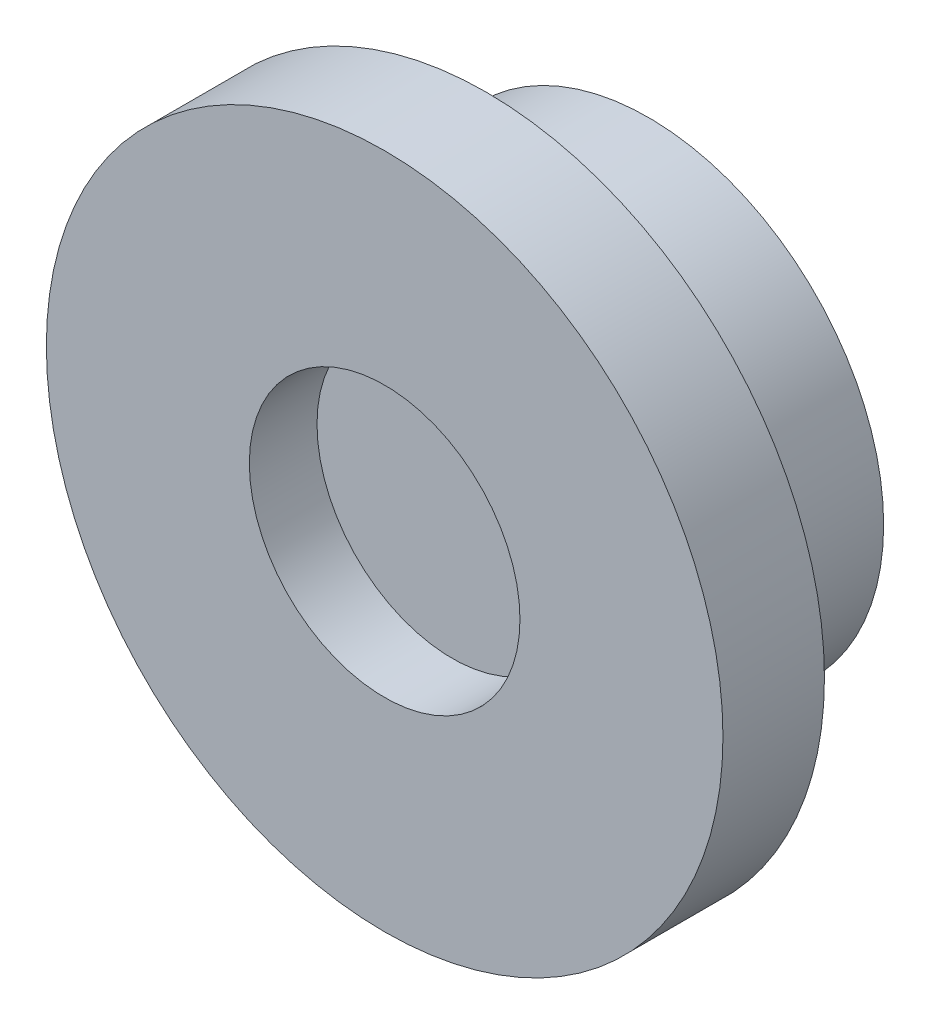
ISO-10303-21;
HEADER;
FILE_DESCRIPTION(('STEP AP214'),'2;1');
FILE_NAME('part.step','',(''),(''),'','','');
FILE_SCHEMA(('AUTOMOTIVE_DESIGN { 1 0 10303 214 1 1 1 1 }'));
ENDSEC;
DATA;
#1=APPLICATION_CONTEXT('core data for automotive mechanical design processes');
#2=APPLICATION_PROTOCOL_DEFINITION('international standard','automotive_design',2000,#1);
#3=PRODUCT_CONTEXT('',#1,'mechanical');
#4=PRODUCT('Part','Part','',(#3));
#5=PRODUCT_RELATED_PRODUCT_CATEGORY('part','',(#4));
#6=PRODUCT_DEFINITION_FORMATION('','',#4);
#7=PRODUCT_DEFINITION_CONTEXT('part definition',#1,'design');
#8=PRODUCT_DEFINITION('design','',#6,#7);
#9=PRODUCT_DEFINITION_SHAPE('','',#8);
#10=(LENGTH_UNIT() NAMED_UNIT(*) SI_UNIT(.MILLI.,.METRE.));
#11=(NAMED_UNIT(*) PLANE_ANGLE_UNIT() SI_UNIT($,.RADIAN.));
#12=(NAMED_UNIT(*) SI_UNIT($,.STERADIAN.) SOLID_ANGLE_UNIT());
#13=UNCERTAINTY_MEASURE_WITH_UNIT(LENGTH_MEASURE(1.E-05),#10,'distance_accuracy_value','');
#14=(GEOMETRIC_REPRESENTATION_CONTEXT(3) GLOBAL_UNCERTAINTY_ASSIGNED_CONTEXT((#13)) GLOBAL_UNIT_ASSIGNED_CONTEXT((#10,
#11,#12)) REPRESENTATION_CONTEXT('',''));
#15=CARTESIAN_POINT('',(0.,0.,0.));
#16=DIRECTION('',(0.,0.,1.));
#17=DIRECTION('',(1.,0.,0.));
#18=AXIS2_PLACEMENT_3D('',#15,#16,#17);
#19=CARTESIAN_POINT('',(0.,0.,51.7));
#20=DIRECTION('',(0.,0.,1.));
#21=DIRECTION('',(1.,0.,0.));
#22=AXIS2_PLACEMENT_3D('',#19,#20,#21);
#23=PLANE('',#22);
#24=CARTESIAN_POINT('',(0.,0.,51.7));
#25=DIRECTION('',(0.,0.,1.));
#26=DIRECTION('',(1.,0.,0.));
#27=AXIS2_PLACEMENT_3D('',#24,#25,#26);
#28=CIRCLE('',#27,6.95);
#29=CARTESIAN_POINT('',(6.95,0.,51.7));
#30=VERTEX_POINT('',#29);
#31=EDGE_CURVE('E9',#30,#30,#28,.T.);
#32=ORIENTED_EDGE('',*,*,#31,.F.);
#33=EDGE_LOOP('',(#32));
#34=FACE_BOUND('',#33,.T.);
#35=ADVANCED_FACE('F15',(#34),#23,.F.);
#36=CARTESIAN_POINT('',(0.,0.,57.5));
#37=DIRECTION('',(0.,0.,1.));
#38=DIRECTION('',(1.,0.,0.));
#39=AXIS2_PLACEMENT_3D('',#36,#37,#38);
#40=PLANE('',#39);
#41=CARTESIAN_POINT('',(0.,0.,57.5));
#42=DIRECTION('',(0.,0.,1.));
#43=DIRECTION('',(1.,0.,0.));
#44=AXIS2_PLACEMENT_3D('',#41,#42,#43);
#45=CIRCLE('',#44,4.);
#46=CARTESIAN_POINT('',(4.,0.,57.5));
#47=VERTEX_POINT('',#46);
#48=EDGE_CURVE('E37',#47,#47,#45,.T.);
#49=ORIENTED_EDGE('',*,*,#48,.T.);
#50=EDGE_LOOP('',(#49));
#51=FACE_BOUND('',#50,.T.);
#52=ADVANCED_FACE('F132',(#51),#40,.T.);
#53=CARTESIAN_POINT('',(0.,0.,51.7));
#54=DIRECTION('',(0.,0.,1.));
#55=DIRECTION('',(1.,0.,0.));
#56=AXIS2_PLACEMENT_3D('',#53,#54,#55);
#57=CYLINDRICAL_SURFACE('',#56,6.95);
#58=CARTESIAN_POINT('',(0.,0.,56.5));
#59=DIRECTION('',(0.,0.,1.));
#60=DIRECTION('',(1.,0.,0.));
#61=AXIS2_PLACEMENT_3D('',#58,#59,#60);
#62=CIRCLE('',#61,6.95);
#63=CARTESIAN_POINT('',(6.95,0.,56.5));
#64=VERTEX_POINT('',#63);
#65=EDGE_CURVE('E82',#64,#64,#62,.T.);
#66=ORIENTED_EDGE('',*,*,#65,.F.);
#67=DIRECTION('',(0.,0.,1.));
#68=VECTOR('',#67,1.);
#69=CARTESIAN_POINT('',(6.95,0.,51.7));
#70=LINE('',#69,#68);
#71=EDGE_CURVE('E23',#30,#64,#70,.T.);
#72=ORIENTED_EDGE('',*,*,#71,.F.);
#73=ORIENTED_EDGE('',*,*,#31,.T.);
#74=ORIENTED_EDGE('',*,*,#71,.T.);
#75=EDGE_LOOP('',(#66,#72,#73,#74));
#76=FACE_BOUND('',#75,.T.);
#77=ADVANCED_FACE('F122',(#76),#57,.T.);
#78=CARTESIAN_POINT('',(0.,0.,57.5));
#79=DIRECTION('',(0.,0.,1.));
#80=DIRECTION('',(1.,0.,0.));
#81=AXIS2_PLACEMENT_3D('',#78,#79,#80);
#82=CYLINDRICAL_SURFACE('',#81,4.);
#83=DIRECTION('',(0.,0.,1.));
#84=VECTOR('',#83,1.);
#85=CARTESIAN_POINT('',(4.,0.,57.5));
#86=LINE('',#85,#84);
#87=CARTESIAN_POINT('',(4.,0.,59.5));
#88=VERTEX_POINT('',#87);
#89=EDGE_CURVE('E85',#47,#88,#86,.T.);
#90=ORIENTED_EDGE('',*,*,#89,.F.);
#91=ORIENTED_EDGE('',*,*,#48,.F.);
#92=ORIENTED_EDGE('',*,*,#89,.T.);
#93=CARTESIAN_POINT('',(0.,0.,59.5));
#94=DIRECTION('',(0.,0.,1.));
#95=DIRECTION('',(1.,0.,0.));
#96=AXIS2_PLACEMENT_3D('',#93,#94,#95);
#97=CIRCLE('',#96,4.);
#98=EDGE_CURVE('E74',#88,#88,#97,.T.);
#99=ORIENTED_EDGE('',*,*,#98,.T.);
#100=EDGE_LOOP('',(#90,#91,#92,#99));
#101=FACE_BOUND('',#100,.T.);
#102=ADVANCED_FACE('F113',(#101),#82,.F.);
#103=CARTESIAN_POINT('',(0.,0.,56.5));
#104=DIRECTION('',(0.,0.,1.));
#105=DIRECTION('',(1.,0.,0.));
#106=AXIS2_PLACEMENT_3D('',#103,#104,#105);
#107=PLANE('',#106);
#108=ORIENTED_EDGE('',*,*,#65,.T.);
#109=EDGE_LOOP('',(#108));
#110=FACE_BOUND('',#109,.T.);
#111=CARTESIAN_POINT('',(0.,0.,56.5));
#112=DIRECTION('',(0.,0.,1.));
#113=DIRECTION('',(1.,0.,0.));
#114=AXIS2_PLACEMENT_3D('',#111,#112,#113);
#115=CIRCLE('',#114,10.);
#116=CARTESIAN_POINT('',(10.,0.,56.5));
#117=VERTEX_POINT('',#116);
#118=EDGE_CURVE('E63',#117,#117,#115,.T.);
#119=ORIENTED_EDGE('',*,*,#118,.F.);
#120=EDGE_LOOP('',(#119));
#121=FACE_BOUND('',#120,.T.);
#122=ADVANCED_FACE('F106',(#110,#121),#107,.F.);
#123=CARTESIAN_POINT('',(0.,0.,59.5));
#124=DIRECTION('',(0.,0.,1.));
#125=DIRECTION('',(1.,0.,0.));
#126=AXIS2_PLACEMENT_3D('',#123,#124,#125);
#127=PLANE('',#126);
#128=ORIENTED_EDGE('',*,*,#98,.F.);
#129=EDGE_LOOP('',(#128));
#130=FACE_BOUND('',#129,.T.);
#131=CARTESIAN_POINT('',(0.,0.,59.5));
#132=DIRECTION('',(0.,0.,1.));
#133=DIRECTION('',(1.,0.,0.));
#134=AXIS2_PLACEMENT_3D('',#131,#132,#133);
#135=CIRCLE('',#134,10.);
#136=CARTESIAN_POINT('',(10.,0.,59.5));
#137=VERTEX_POINT('',#136);
#138=EDGE_CURVE('E62',#137,#137,#135,.T.);
#139=ORIENTED_EDGE('',*,*,#138,.T.);
#140=EDGE_LOOP('',(#139));
#141=FACE_BOUND('',#140,.T.);
#142=ADVANCED_FACE('F68',(#130,#141),#127,.T.);
#143=CARTESIAN_POINT('',(0.,0.,56.5));
#144=DIRECTION('',(0.,0.,1.));
#145=DIRECTION('',(1.,0.,0.));
#146=AXIS2_PLACEMENT_3D('',#143,#144,#145);
#147=CYLINDRICAL_SURFACE('',#146,10.);
#148=ORIENTED_EDGE('',*,*,#138,.F.);
#149=DIRECTION('',(0.,0.,1.));
#150=VECTOR('',#149,1.);
#151=CARTESIAN_POINT('',(10.,0.,56.5));
#152=LINE('',#151,#150);
#153=EDGE_CURVE('E56',#117,#137,#152,.T.);
#154=ORIENTED_EDGE('',*,*,#153,.F.);
#155=ORIENTED_EDGE('',*,*,#118,.T.);
#156=ORIENTED_EDGE('',*,*,#153,.T.);
#157=EDGE_LOOP('',(#148,#154,#155,#156));
#158=FACE_BOUND('',#157,.T.);
#159=ADVANCED_FACE('F61',(#158),#147,.T.);
#160=CLOSED_SHELL('',(#35,#52,#77,#102,#122,#142,#159));
#161=MANIFOLD_SOLID_BREP('B1',#160);
#162=ADVANCED_BREP_SHAPE_REPRESENTATION('',(#18,#161),#14);
#163=SHAPE_DEFINITION_REPRESENTATION(#9,#162);
ENDSEC;
END-ISO-10303-21;
